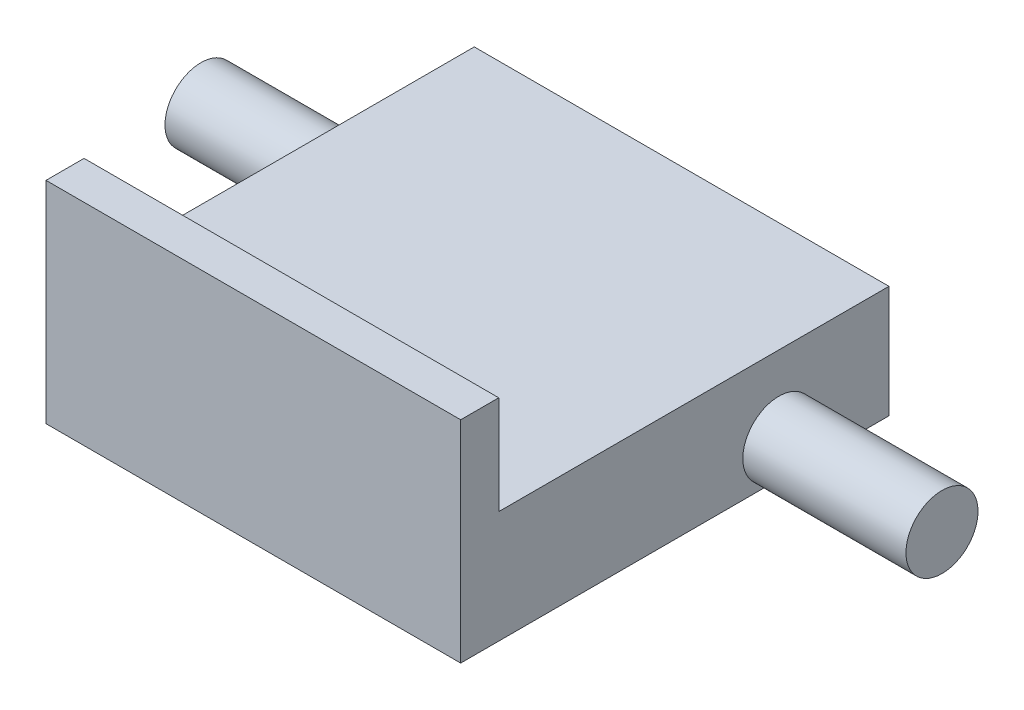
ISO-10303-21;
HEADER;
FILE_DESCRIPTION(('STEP AP214'),'2;1');
FILE_NAME('part.step','',(''),(''),'','','');
FILE_SCHEMA(('AUTOMOTIVE_DESIGN { 1 0 10303 214 1 1 1 1 }'));
ENDSEC;
DATA;
#1=APPLICATION_CONTEXT('core data for automotive mechanical design processes');
#2=APPLICATION_PROTOCOL_DEFINITION('international standard','automotive_design',2000,#1);
#3=PRODUCT_CONTEXT('',#1,'mechanical');
#4=PRODUCT('Part','Part','',(#3));
#5=PRODUCT_RELATED_PRODUCT_CATEGORY('part','',(#4));
#6=PRODUCT_DEFINITION_FORMATION('','',#4);
#7=PRODUCT_DEFINITION_CONTEXT('part definition',#1,'design');
#8=PRODUCT_DEFINITION('design','',#6,#7);
#9=PRODUCT_DEFINITION_SHAPE('','',#8);
#10=(LENGTH_UNIT() NAMED_UNIT(*) SI_UNIT(.MILLI.,.METRE.));
#11=(NAMED_UNIT(*) PLANE_ANGLE_UNIT() SI_UNIT($,.RADIAN.));
#12=(NAMED_UNIT(*) SI_UNIT($,.STERADIAN.) SOLID_ANGLE_UNIT());
#13=UNCERTAINTY_MEASURE_WITH_UNIT(LENGTH_MEASURE(1.E-05),#10,'distance_accuracy_value','');
#14=(GEOMETRIC_REPRESENTATION_CONTEXT(3) GLOBAL_UNCERTAINTY_ASSIGNED_CONTEXT((#13)) GLOBAL_UNIT_ASSIGNED_CONTEXT((#10,
#11,#12)) REPRESENTATION_CONTEXT('',''));
#15=CARTESIAN_POINT('',(0.,0.,0.));
#16=DIRECTION('',(0.,0.,1.));
#17=DIRECTION('',(1.,0.,0.));
#18=AXIS2_PLACEMENT_3D('',#15,#16,#17);
#19=CARTESIAN_POINT('',(-60.5877367896311,23.8172482552342,31.4999999999999));
#20=DIRECTION('',(1.,0.,0.));
#21=DIRECTION('',(0.,0.999999999999998,0.));
#22=AXIS2_PLACEMENT_3D('',#19,#20,#21);
#23=PLANE('',#22);
#24=DIRECTION('',(0.,0.,-0.999999999999997));
#25=VECTOR('',#24,1.);
#26=CARTESIAN_POINT('',(-60.5877367896311,15.5672482552342,31.4999999999999));
#27=LINE('',#26,#25);
#28=CARTESIAN_POINT('',(-60.5877367896311,15.5672482552343,8.1));
#29=VERTEX_POINT('',#28);
#30=CARTESIAN_POINT('',(-60.5877367896311,15.5672482552343,0.));
#31=VERTEX_POINT('',#30);
#32=EDGE_CURVE('E88',#29,#31,#27,.T.);
#33=ORIENTED_EDGE('',*,*,#32,.F.);
#34=CARTESIAN_POINT('',(-60.5877367896311,18.2172482552343,8.1));
#35=DIRECTION('',(-1.,0.,0.));
#36=DIRECTION('',(0.,-0.999999999999998,0.));
#37=AXIS2_PLACEMENT_3D('',#34,#35,#36);
#38=CIRCLE('',#37,2.65);
#39=EDGE_CURVE('E94',#29,#29,#38,.T.);
#40=ORIENTED_EDGE('',*,*,#39,.F.);
#41=CARTESIAN_POINT('',(-60.5877367896311,15.5672482552342,31.4999999999999));
#42=VERTEX_POINT('',#41);
#43=EDGE_CURVE('E37',#42,#29,#27,.T.);
#44=ORIENTED_EDGE('',*,*,#43,.F.);
#45=DIRECTION('',(0.,-0.999999999999998,0.));
#46=VECTOR('',#45,1.);
#47=CARTESIAN_POINT('',(-60.5877367896311,23.8172482552342,31.4999999999999));
#48=LINE('',#47,#46);
#49=CARTESIAN_POINT('',(-60.5877367896311,31.0672482552342,31.4999999999999));
#50=VERTEX_POINT('',#49);
#51=EDGE_CURVE('E109',#50,#42,#48,.T.);
#52=ORIENTED_EDGE('',*,*,#51,.F.);
#53=DIRECTION('',(0.,0.,0.999999999999997));
#54=VECTOR('',#53,1.);
#55=CARTESIAN_POINT('',(-60.5877367896311,31.0672482552342,28.6999999999999));
#56=LINE('',#55,#54);
#57=CARTESIAN_POINT('',(-60.5877367896311,31.0672482552342,28.6999999999999));
#58=VERTEX_POINT('',#57);
#59=EDGE_CURVE('E120',#58,#50,#56,.T.);
#60=ORIENTED_EDGE('',*,*,#59,.F.);
#61=DIRECTION('',(0.,-0.999999999999998,0.));
#62=VECTOR('',#61,1.);
#63=CARTESIAN_POINT('',(-60.5877367896312,15.5672482552343,28.6999999999999));
#64=LINE('',#63,#62);
#65=CARTESIAN_POINT('',(-60.5877367896311,23.8172482552342,28.6999999999999));
#66=VERTEX_POINT('',#65);
#67=EDGE_CURVE('E124',#58,#66,#64,.T.);
#68=ORIENTED_EDGE('',*,*,#67,.T.);
#69=DIRECTION('',(0.,0.,-0.999999999999997));
#70=VECTOR('',#69,1.);
#71=CARTESIAN_POINT('',(-60.5877367896311,23.8172482552342,31.4999999999999));
#72=LINE('',#71,#70);
#73=CARTESIAN_POINT('',(-60.5877367896311,23.8172482552343,0.));
#74=VERTEX_POINT('',#73);
#75=EDGE_CURVE('E104',#66,#74,#72,.T.);
#76=ORIENTED_EDGE('',*,*,#75,.T.);
#77=DIRECTION('',(0.,-0.999999999999998,0.));
#78=VECTOR('',#77,1.);
#79=CARTESIAN_POINT('',(-60.5877367896311,23.8172482552343,0.));
#80=LINE('',#79,#78);
#81=EDGE_CURVE('E96',#74,#31,#80,.T.);
#82=ORIENTED_EDGE('',*,*,#81,.T.);
#83=EDGE_LOOP('',(#33,#40,#44,#52,#60,#68,#76,#82));
#84=FACE_BOUND('',#83,.T.);
#85=ADVANCED_FACE('F30',(#84),#23,.F.);
#86=CARTESIAN_POINT('',(-60.5877367896311,23.8172482552342,31.4999999999999));
#87=DIRECTION('',(0.,-0.999999999999998,0.));
#88=DIRECTION('',(0.,0.,-0.999999999999997));
#89=AXIS2_PLACEMENT_3D('',#86,#87,#88);
#90=PLANE('',#89);
#91=DIRECTION('',(-1.,0.,0.));
#92=VECTOR('',#91,1.);
#93=CARTESIAN_POINT('',(-60.5877367896311,23.8172482552342,28.6999999999999));
#94=LINE('',#93,#92);
#95=CARTESIAN_POINT('',(-30.0877367896311,23.8172482552342,28.6999999999999));
#96=VERTEX_POINT('',#95);
#97=EDGE_CURVE('E11',#96,#66,#94,.T.);
#98=ORIENTED_EDGE('',*,*,#97,.F.);
#99=DIRECTION('',(0.,0.,-0.999999999999997));
#100=VECTOR('',#99,1.);
#101=CARTESIAN_POINT('',(-30.0877367896311,23.8172482552342,31.4999999999999));
#102=LINE('',#101,#100);
#103=CARTESIAN_POINT('',(-30.0877367896311,23.8172482552343,0.));
#104=VERTEX_POINT('',#103);
#105=EDGE_CURVE('E102',#96,#104,#102,.T.);
#106=ORIENTED_EDGE('',*,*,#105,.T.);
#107=DIRECTION('',(-1.,0.,0.));
#108=VECTOR('',#107,1.);
#109=CARTESIAN_POINT('',(-60.5877367896311,23.8172482552343,0.));
#110=LINE('',#109,#108);
#111=EDGE_CURVE('E111',#104,#74,#110,.T.);
#112=ORIENTED_EDGE('',*,*,#111,.T.);
#113=ORIENTED_EDGE('',*,*,#75,.F.);
#114=EDGE_LOOP('',(#98,#106,#112,#113));
#115=FACE_BOUND('',#114,.T.);
#116=ADVANCED_FACE('F156',(#115),#90,.F.);
#117=CARTESIAN_POINT('',(-60.5877367896311,15.5672482552342,31.4999999999999));
#118=DIRECTION('',(0.,0.999999999999998,0.));
#119=DIRECTION('',(0.,0.,0.999999999999997));
#120=AXIS2_PLACEMENT_3D('',#117,#118,#119);
#121=PLANE('',#120);
#122=ORIENTED_EDGE('',*,*,#43,.T.);
#123=ORIENTED_EDGE('',*,*,#32,.T.);
#124=DIRECTION('',(1.,0.,0.));
#125=VECTOR('',#124,1.);
#126=CARTESIAN_POINT('',(-60.5877367896311,15.5672482552343,0.));
#127=LINE('',#126,#125);
#128=CARTESIAN_POINT('',(-30.0877367896311,15.5672482552343,0.));
#129=VERTEX_POINT('',#128);
#130=EDGE_CURVE('E117',#31,#129,#127,.T.);
#131=ORIENTED_EDGE('',*,*,#130,.T.);
#132=DIRECTION('',(0.,0.,-0.999999999999997));
#133=VECTOR('',#132,1.);
#134=CARTESIAN_POINT('',(-30.0877367896311,15.5672482552343,31.4999999999999));
#135=LINE('',#134,#133);
#136=CARTESIAN_POINT('',(-30.0877367896311,15.5672482552343,8.09999999999997));
#137=VERTEX_POINT('',#136);
#138=EDGE_CURVE('E99',#137,#129,#135,.T.);
#139=ORIENTED_EDGE('',*,*,#138,.F.);
#140=CARTESIAN_POINT('',(-30.0877367896311,15.5672482552343,31.4999999999999));
#141=VERTEX_POINT('',#140);
#142=EDGE_CURVE('E97',#141,#137,#135,.T.);
#143=ORIENTED_EDGE('',*,*,#142,.F.);
#144=DIRECTION('',(1.,0.,0.));
#145=VECTOR('',#144,1.);
#146=CARTESIAN_POINT('',(-60.5877367896311,15.5672482552342,31.4999999999999));
#147=LINE('',#146,#145);
#148=EDGE_CURVE('E49',#42,#141,#147,.T.);
#149=ORIENTED_EDGE('',*,*,#148,.F.);
#150=EDGE_LOOP('',(#122,#123,#131,#139,#143,#149));
#151=FACE_BOUND('',#150,.T.);
#152=ADVANCED_FACE('F86',(#151),#121,.F.);
#153=CARTESIAN_POINT('',(-30.0877367896311,23.8172482552342,31.4999999999999));
#154=DIRECTION('',(-1.,0.,0.));
#155=DIRECTION('',(0.,-0.999999999999998,0.));
#156=AXIS2_PLACEMENT_3D('',#153,#154,#155);
#157=PLANE('',#156);
#158=ORIENTED_EDGE('',*,*,#142,.T.);
#159=CARTESIAN_POINT('',(-30.0877367896311,18.2172482552342,8.09999999999996));
#160=DIRECTION('',(-1.,0.,0.));
#161=DIRECTION('',(0.,-0.999999999999998,0.));
#162=AXIS2_PLACEMENT_3D('',#159,#160,#161);
#163=CIRCLE('',#162,2.65);
#164=EDGE_CURVE('E42',#137,#137,#163,.T.);
#165=ORIENTED_EDGE('',*,*,#164,.T.);
#166=ORIENTED_EDGE('',*,*,#138,.T.);
#167=DIRECTION('',(0.,0.999999999999998,0.));
#168=VECTOR('',#167,1.);
#169=CARTESIAN_POINT('',(-30.0877367896311,23.8172482552343,0.));
#170=LINE('',#169,#168);
#171=EDGE_CURVE('E114',#129,#104,#170,.T.);
#172=ORIENTED_EDGE('',*,*,#171,.T.);
#173=ORIENTED_EDGE('',*,*,#105,.F.);
#174=DIRECTION('',(0.,0.999999999999998,0.));
#175=VECTOR('',#174,1.);
#176=CARTESIAN_POINT('',(-30.0877367896311,15.5672482552343,28.6999999999999));
#177=LINE('',#176,#175);
#178=CARTESIAN_POINT('',(-30.0877367896311,31.0672482552342,28.6999999999999));
#179=VERTEX_POINT('',#178);
#180=EDGE_CURVE('E132',#96,#179,#177,.T.);
#181=ORIENTED_EDGE('',*,*,#180,.T.);
#182=DIRECTION('',(0.,0.,0.999999999999997));
#183=VECTOR('',#182,1.);
#184=CARTESIAN_POINT('',(-30.0877367896311,31.0672482552342,28.6999999999999));
#185=LINE('',#184,#183);
#186=CARTESIAN_POINT('',(-30.0877367896311,31.0672482552342,31.4999999999999));
#187=VERTEX_POINT('',#186);
#188=EDGE_CURVE('E121',#179,#187,#185,.T.);
#189=ORIENTED_EDGE('',*,*,#188,.T.);
#190=DIRECTION('',(0.,0.999999999999998,0.));
#191=VECTOR('',#190,1.);
#192=CARTESIAN_POINT('',(-30.0877367896311,23.8172482552342,31.4999999999999));
#193=LINE('',#192,#191);
#194=EDGE_CURVE('E106',#141,#187,#193,.T.);
#195=ORIENTED_EDGE('',*,*,#194,.F.);
#196=EDGE_LOOP('',(#158,#165,#166,#172,#173,#181,#189,#195));
#197=FACE_BOUND('',#196,.T.);
#198=ADVANCED_FACE('F146',(#197),#157,.F.);
#199=CARTESIAN_POINT('',(-60.5877367896311,15.5672482552342,31.4999999999999));
#200=DIRECTION('',(0.,0.,0.999999999999997));
#201=DIRECTION('',(1.,0.,0.));
#202=AXIS2_PLACEMENT_3D('',#199,#200,#201);
#203=PLANE('',#202);
#204=ORIENTED_EDGE('',*,*,#51,.T.);
#205=ORIENTED_EDGE('',*,*,#148,.T.);
#206=ORIENTED_EDGE('',*,*,#194,.T.);
#207=DIRECTION('',(-1.,0.,0.));
#208=VECTOR('',#207,1.);
#209=CARTESIAN_POINT('',(-30.0877367896311,31.0672482552342,31.4999999999999));
#210=LINE('',#209,#208);
#211=EDGE_CURVE('E134',#187,#50,#210,.T.);
#212=ORIENTED_EDGE('',*,*,#211,.T.);
#213=EDGE_LOOP('',(#204,#205,#206,#212));
#214=FACE_BOUND('',#213,.T.);
#215=ADVANCED_FACE('F165',(#214),#203,.T.);
#216=CARTESIAN_POINT('',(-60.5877367896311,15.5672482552343,0.));
#217=DIRECTION('',(0.,0.,0.999999999999997));
#218=DIRECTION('',(1.,0.,0.));
#219=AXIS2_PLACEMENT_3D('',#216,#217,#218);
#220=PLANE('',#219);
#221=ORIENTED_EDGE('',*,*,#81,.F.);
#222=ORIENTED_EDGE('',*,*,#111,.F.);
#223=ORIENTED_EDGE('',*,*,#171,.F.);
#224=ORIENTED_EDGE('',*,*,#130,.F.);
#225=EDGE_LOOP('',(#221,#222,#223,#224));
#226=FACE_BOUND('',#225,.T.);
#227=ADVANCED_FACE('F151',(#226),#220,.F.);
#228=CARTESIAN_POINT('',(-30.0877367896311,15.5672482552343,28.6999999999999));
#229=DIRECTION('',(0.,0.,0.999999999999997));
#230=DIRECTION('',(1.,0.,0.));
#231=AXIS2_PLACEMENT_3D('',#228,#229,#230);
#232=PLANE('',#231);
#233=ORIENTED_EDGE('',*,*,#180,.F.);
#234=ORIENTED_EDGE('',*,*,#97,.T.);
#235=ORIENTED_EDGE('',*,*,#67,.F.);
#236=DIRECTION('',(-1.,0.,0.));
#237=VECTOR('',#236,1.);
#238=CARTESIAN_POINT('',(-30.0877367896311,31.0672482552342,28.6999999999999));
#239=LINE('',#238,#237);
#240=EDGE_CURVE('E129',#179,#58,#239,.T.);
#241=ORIENTED_EDGE('',*,*,#240,.F.);
#242=EDGE_LOOP('',(#233,#234,#235,#241));
#243=FACE_BOUND('',#242,.T.);
#244=ADVANCED_FACE('F160',(#243),#232,.F.);
#245=CARTESIAN_POINT('',(-30.0877367896311,31.0672482552342,28.6999999999999));
#246=DIRECTION('',(0.,0.999999999999998,0.));
#247=DIRECTION('',(-1.,0.,0.));
#248=AXIS2_PLACEMENT_3D('',#245,#246,#247);
#249=PLANE('',#248);
#250=ORIENTED_EDGE('',*,*,#211,.F.);
#251=ORIENTED_EDGE('',*,*,#188,.F.);
#252=ORIENTED_EDGE('',*,*,#240,.T.);
#253=ORIENTED_EDGE('',*,*,#59,.T.);
#254=EDGE_LOOP('',(#250,#251,#252,#253));
#255=FACE_BOUND('',#254,.T.);
#256=ADVANCED_FACE('F164',(#255),#249,.T.);
#257=CARTESIAN_POINT('',(-72.5877367896311,18.2172482552343,8.1));
#258=DIRECTION('',(1.,0.,0.));
#259=DIRECTION('',(0.,0.999999999999998,0.));
#260=AXIS2_PLACEMENT_3D('',#257,#258,#259);
#261=CYLINDRICAL_SURFACE('',#260,2.65);
#262=CARTESIAN_POINT('',(-72.5877367896311,18.2172482552343,8.1));
#263=DIRECTION('',(-1.,0.,0.));
#264=DIRECTION('',(0.,-0.999999999999998,0.));
#265=AXIS2_PLACEMENT_3D('',#262,#263,#264);
#266=CIRCLE('',#265,2.65);
#267=CARTESIAN_POINT('',(-72.5877367896311,15.5672482552343,8.1));
#268=VERTEX_POINT('',#267);
#269=EDGE_CURVE('E137',#268,#268,#266,.T.);
#270=ORIENTED_EDGE('',*,*,#269,.F.);
#271=EDGE_LOOP('',(#270));
#272=FACE_BOUND('',#271,.T.);
#273=ORIENTED_EDGE('',*,*,#39,.T.);
#274=EDGE_LOOP('',(#273));
#275=FACE_BOUND('',#274,.T.);
#276=ADVANCED_FACE('F219',(#272,#275),#261,.T.);
#277=CARTESIAN_POINT('',(-72.5877367896311,18.2172482552343,8.1));
#278=DIRECTION('',(-1.,0.,0.));
#279=DIRECTION('',(0.,-0.999999999999998,0.));
#280=AXIS2_PLACEMENT_3D('',#277,#278,#279);
#281=PLANE('',#280);
#282=ORIENTED_EDGE('',*,*,#269,.T.);
#283=EDGE_LOOP('',(#282));
#284=FACE_BOUND('',#283,.T.);
#285=ADVANCED_FACE('F228',(#284),#281,.T.);
#286=CARTESIAN_POINT('',(-18.087736789631,18.2172482552342,8.09999999999996));
#287=DIRECTION('',(-1.,0.,0.));
#288=DIRECTION('',(0.,-0.999999999999998,0.));
#289=AXIS2_PLACEMENT_3D('',#286,#287,#288);
#290=CYLINDRICAL_SURFACE('',#289,2.65);
#291=CARTESIAN_POINT('',(-18.087736789631,18.2172482552342,8.09999999999996));
#292=DIRECTION('',(-1.,0.,0.));
#293=DIRECTION('',(0.,-0.999999999999998,0.));
#294=AXIS2_PLACEMENT_3D('',#291,#292,#293);
#295=CIRCLE('',#294,2.65);
#296=CARTESIAN_POINT('',(-18.087736789631,15.5672482552342,8.09999999999996));
#297=VERTEX_POINT('',#296);
#298=EDGE_CURVE('E141',#297,#297,#295,.T.);
#299=ORIENTED_EDGE('',*,*,#298,.T.);
#300=EDGE_LOOP('',(#299));
#301=FACE_BOUND('',#300,.T.);
#302=ORIENTED_EDGE('',*,*,#164,.F.);
#303=EDGE_LOOP('',(#302));
#304=FACE_BOUND('',#303,.T.);
#305=ADVANCED_FACE('F239',(#301,#304),#290,.T.);
#306=CARTESIAN_POINT('',(-18.087736789631,18.2172482552342,8.09999999999996));
#307=DIRECTION('',(1.,0.,0.));
#308=DIRECTION('',(0.,-0.999999999999998,0.));
#309=AXIS2_PLACEMENT_3D('',#306,#307,#308);
#310=PLANE('',#309);
#311=ORIENTED_EDGE('',*,*,#298,.F.);
#312=EDGE_LOOP('',(#311));
#313=FACE_BOUND('',#312,.T.);
#314=ADVANCED_FACE('F249',(#313),#310,.T.);
#315=CLOSED_SHELL('',(#85,#116,#152,#198,#215,#227,#244,#256,#276,#285,#305,#314));
#316=MANIFOLD_SOLID_BREP('B2',#315);
#317=ADVANCED_BREP_SHAPE_REPRESENTATION('',(#18,#316),#14);
#318=SHAPE_DEFINITION_REPRESENTATION(#9,#317);
ENDSEC;
END-ISO-10303-21;
